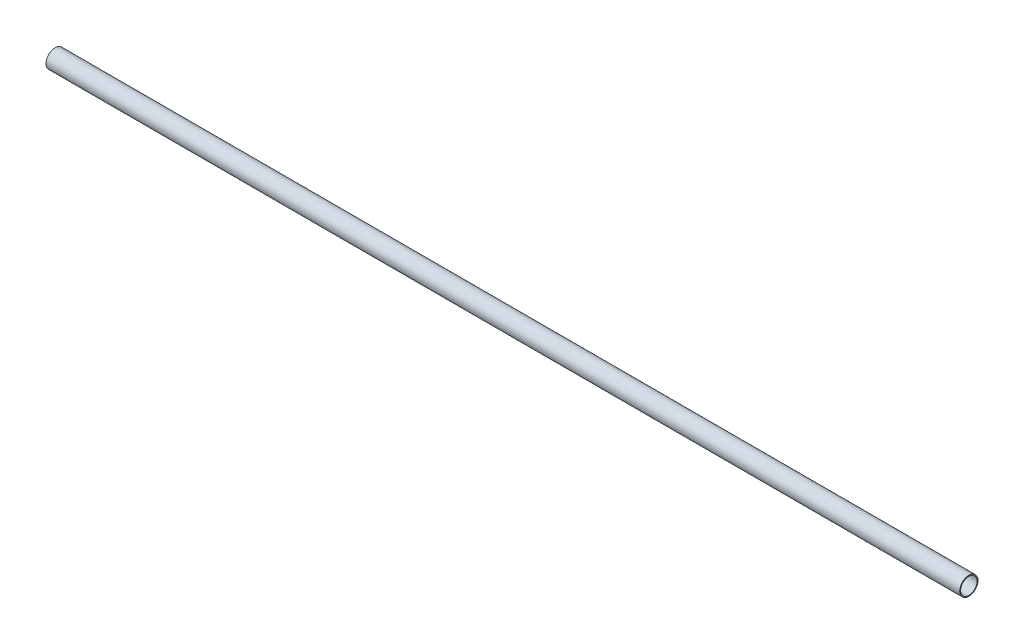
ISO-10303-21;
HEADER;
FILE_DESCRIPTION(('STEP AP214'),'2;1');
FILE_NAME('part.step','',(''),(''),'','','');
FILE_SCHEMA(('AUTOMOTIVE_DESIGN { 1 0 10303 214 1 1 1 1 }'));
ENDSEC;
DATA;
#1=APPLICATION_CONTEXT('core data for automotive mechanical design processes');
#2=APPLICATION_PROTOCOL_DEFINITION('international standard','automotive_design',2000,#1);
#3=PRODUCT_CONTEXT('',#1,'mechanical');
#4=PRODUCT('Part','Part','',(#3));
#5=PRODUCT_RELATED_PRODUCT_CATEGORY('part','',(#4));
#6=PRODUCT_DEFINITION_FORMATION('','',#4);
#7=PRODUCT_DEFINITION_CONTEXT('part definition',#1,'design');
#8=PRODUCT_DEFINITION('design','',#6,#7);
#9=PRODUCT_DEFINITION_SHAPE('','',#8);
#10=(LENGTH_UNIT() NAMED_UNIT(*) SI_UNIT(.MILLI.,.METRE.));
#11=(NAMED_UNIT(*) PLANE_ANGLE_UNIT() SI_UNIT($,.RADIAN.));
#12=(NAMED_UNIT(*) SI_UNIT($,.STERADIAN.) SOLID_ANGLE_UNIT());
#13=UNCERTAINTY_MEASURE_WITH_UNIT(LENGTH_MEASURE(1.E-05),#10,'distance_accuracy_value','');
#14=(GEOMETRIC_REPRESENTATION_CONTEXT(3) GLOBAL_UNCERTAINTY_ASSIGNED_CONTEXT((#13)) GLOBAL_UNIT_ASSIGNED_CONTEXT((#10,
#11,#12)) REPRESENTATION_CONTEXT('',''));
#15=CARTESIAN_POINT('',(0.,0.,0.));
#16=DIRECTION('',(0.,0.,1.));
#17=DIRECTION('',(1.,0.,0.));
#18=AXIS2_PLACEMENT_3D('',#15,#16,#17);
#19=CARTESIAN_POINT('',(500.,0.,0.));
#20=DIRECTION('',(1.,0.,0.));
#21=DIRECTION('',(0.,0.,-1.));
#22=AXIS2_PLACEMENT_3D('',#19,#20,#21);
#23=PLANE('',#22);
#24=CARTESIAN_POINT('',(500.,0.,0.));
#25=DIRECTION('',(1.,0.,0.));
#26=DIRECTION('',(0.,0.,-1.));
#27=AXIS2_PLACEMENT_3D('',#24,#25,#26);
#28=CIRCLE('',#27,10.);
#29=CARTESIAN_POINT('',(500.,0.,-10.));
#30=VERTEX_POINT('',#29);
#31=EDGE_CURVE('E10',#30,#30,#28,.T.);
#32=ORIENTED_EDGE('',*,*,#31,.T.);
#33=EDGE_LOOP('',(#32));
#34=FACE_BOUND('',#33,.T.);
#35=CARTESIAN_POINT('',(500.,0.,0.));
#36=DIRECTION('',(1.,0.,0.));
#37=DIRECTION('',(0.,0.,-1.));
#38=AXIS2_PLACEMENT_3D('',#35,#36,#37);
#39=CIRCLE('',#38,9.);
#40=CARTESIAN_POINT('',(500.,0.,-9.));
#41=VERTEX_POINT('',#40);
#42=EDGE_CURVE('E48',#41,#41,#39,.T.);
#43=ORIENTED_EDGE('',*,*,#42,.F.);
#44=EDGE_LOOP('',(#43));
#45=FACE_BOUND('',#44,.T.);
#46=ADVANCED_FACE('F40',(#34,#45),#23,.T.);
#47=CARTESIAN_POINT('',(-500.,0.,0.));
#48=DIRECTION('',(1.,0.,0.));
#49=DIRECTION('',(0.,0.,-1.));
#50=AXIS2_PLACEMENT_3D('',#47,#48,#49);
#51=PLANE('',#50);
#52=CARTESIAN_POINT('',(-500.,0.,0.));
#53=DIRECTION('',(1.,0.,0.));
#54=DIRECTION('',(0.,0.,-1.));
#55=AXIS2_PLACEMENT_3D('',#52,#53,#54);
#56=CIRCLE('',#55,10.);
#57=CARTESIAN_POINT('',(-500.,0.,-10.));
#58=VERTEX_POINT('',#57);
#59=EDGE_CURVE('E41',#58,#58,#56,.T.);
#60=ORIENTED_EDGE('',*,*,#59,.F.);
#61=EDGE_LOOP('',(#60));
#62=FACE_BOUND('',#61,.T.);
#63=CARTESIAN_POINT('',(-500.,0.,0.));
#64=DIRECTION('',(1.,0.,0.));
#65=DIRECTION('',(0.,0.,-1.));
#66=AXIS2_PLACEMENT_3D('',#63,#64,#65);
#67=CIRCLE('',#66,9.);
#68=CARTESIAN_POINT('',(-500.,0.,-9.));
#69=VERTEX_POINT('',#68);
#70=EDGE_CURVE('E49',#69,#69,#67,.T.);
#71=ORIENTED_EDGE('',*,*,#70,.T.);
#72=EDGE_LOOP('',(#71));
#73=FACE_BOUND('',#72,.T.);
#74=ADVANCED_FACE('F58',(#62,#73),#51,.F.);
#75=CARTESIAN_POINT('',(500.,0.,0.));
#76=DIRECTION('',(-1.,0.,0.));
#77=DIRECTION('',(0.,0.,1.));
#78=AXIS2_PLACEMENT_3D('',#75,#76,#77);
#79=CYLINDRICAL_SURFACE('',#78,10.);
#80=ORIENTED_EDGE('',*,*,#31,.F.);
#81=EDGE_LOOP('',(#80));
#82=FACE_BOUND('',#81,.T.);
#83=ORIENTED_EDGE('',*,*,#59,.T.);
#84=EDGE_LOOP('',(#83));
#85=FACE_BOUND('',#84,.T.);
#86=ADVANCED_FACE('F39',(#82,#85),#79,.T.);
#87=CARTESIAN_POINT('',(500.,0.,0.));
#88=DIRECTION('',(-1.,0.,0.));
#89=DIRECTION('',(0.,0.,1.));
#90=AXIS2_PLACEMENT_3D('',#87,#88,#89);
#91=CYLINDRICAL_SURFACE('',#90,9.);
#92=ORIENTED_EDGE('',*,*,#42,.T.);
#93=EDGE_LOOP('',(#92));
#94=FACE_BOUND('',#93,.T.);
#95=ORIENTED_EDGE('',*,*,#70,.F.);
#96=EDGE_LOOP('',(#95));
#97=FACE_BOUND('',#96,.T.);
#98=ADVANCED_FACE('F57',(#94,#97),#91,.F.);
#99=CLOSED_SHELL('',(#46,#74,#86,#98));
#100=MANIFOLD_SOLID_BREP('B2',#99);
#101=ADVANCED_BREP_SHAPE_REPRESENTATION('',(#18,#100),#14);
#102=SHAPE_DEFINITION_REPRESENTATION(#9,#101);
ENDSEC;
END-ISO-10303-21;
